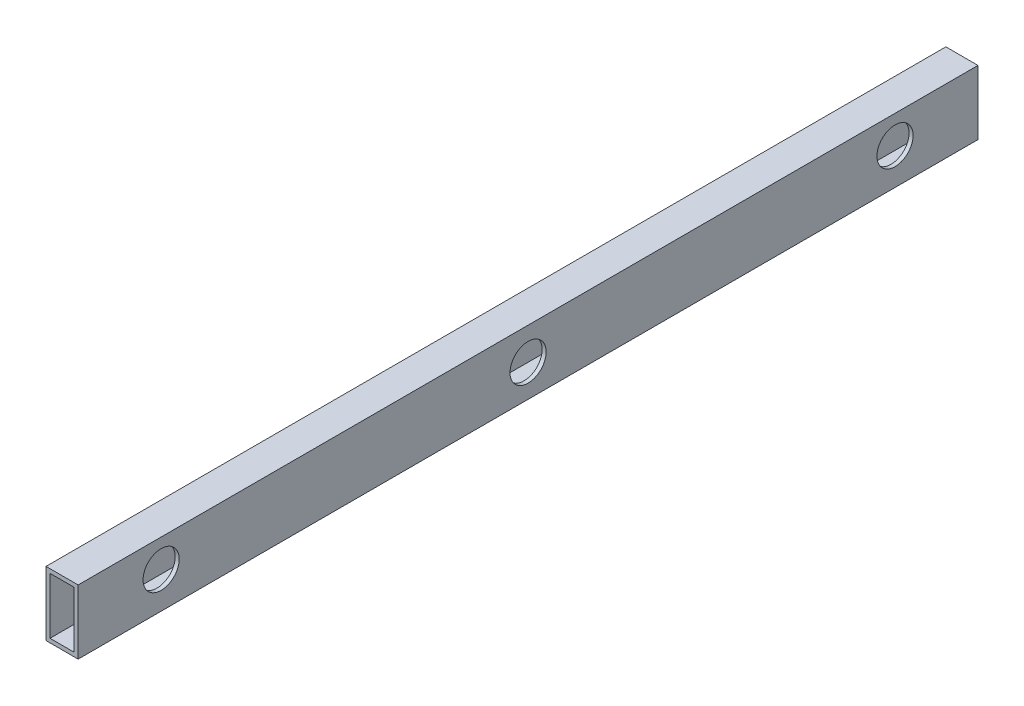
ISO-10303-21;
HEADER;
FILE_DESCRIPTION(('STEP AP214'),'2;1');
FILE_NAME('part.step','',(''),(''),'','','');
FILE_SCHEMA(('AUTOMOTIVE_DESIGN { 1 0 10303 214 1 1 1 1 }'));
ENDSEC;
DATA;
#1=APPLICATION_CONTEXT('core data for automotive mechanical design processes');
#2=APPLICATION_PROTOCOL_DEFINITION('international standard','automotive_design',2000,#1);
#3=PRODUCT_CONTEXT('',#1,'mechanical');
#4=PRODUCT('Part','Part','',(#3));
#5=PRODUCT_RELATED_PRODUCT_CATEGORY('part','',(#4));
#6=PRODUCT_DEFINITION_FORMATION('','',#4);
#7=PRODUCT_DEFINITION_CONTEXT('part definition',#1,'design');
#8=PRODUCT_DEFINITION('design','',#6,#7);
#9=PRODUCT_DEFINITION_SHAPE('','',#8);
#10=(LENGTH_UNIT() NAMED_UNIT(*) SI_UNIT(.MILLI.,.METRE.));
#11=(NAMED_UNIT(*) PLANE_ANGLE_UNIT() SI_UNIT($,.RADIAN.));
#12=(NAMED_UNIT(*) SI_UNIT($,.STERADIAN.) SOLID_ANGLE_UNIT());
#13=UNCERTAINTY_MEASURE_WITH_UNIT(LENGTH_MEASURE(1.E-05),#10,'distance_accuracy_value','');
#14=(GEOMETRIC_REPRESENTATION_CONTEXT(3) GLOBAL_UNCERTAINTY_ASSIGNED_CONTEXT((#13)) GLOBAL_UNIT_ASSIGNED_CONTEXT((#10,
#11,#12)) REPRESENTATION_CONTEXT('',''));
#15=CARTESIAN_POINT('',(0.,0.,0.));
#16=DIRECTION('',(0.,0.,1.));
#17=DIRECTION('',(1.,0.,0.));
#18=AXIS2_PLACEMENT_3D('',#15,#16,#17);
#19=CARTESIAN_POINT('',(0.,0.,355.6));
#20=DIRECTION('',(0.,0.,1.));
#21=DIRECTION('',(1.,0.,0.));
#22=AXIS2_PLACEMENT_3D('',#19,#20,#21);
#23=PLANE('',#22);
#24=DIRECTION('',(0.,1.,0.));
#25=VECTOR('',#24,1.);
#26=CARTESIAN_POINT('',(292.1,-25.4,355.6));
#27=LINE('',#26,#25);
#28=CARTESIAN_POINT('',(292.1,-25.4,355.6));
#29=VERTEX_POINT('',#28);
#30=CARTESIAN_POINT('',(292.1,25.4,355.6));
#31=VERTEX_POINT('',#30);
#32=EDGE_CURVE('E124',#29,#31,#27,.T.);
#33=ORIENTED_EDGE('',*,*,#32,.T.);
#34=DIRECTION('',(-1.,0.,0.));
#35=VECTOR('',#34,1.);
#36=CARTESIAN_POINT('',(292.1,25.4,355.6));
#37=LINE('',#36,#35);
#38=CARTESIAN_POINT('',(266.7,25.4,355.6));
#39=VERTEX_POINT('',#38);
#40=EDGE_CURVE('E172',#31,#39,#37,.T.);
#41=ORIENTED_EDGE('',*,*,#40,.T.);
#42=DIRECTION('',(0.,-1.,0.));
#43=VECTOR('',#42,1.);
#44=CARTESIAN_POINT('',(266.7,-25.4,355.6));
#45=LINE('',#44,#43);
#46=CARTESIAN_POINT('',(266.7,-25.4,355.6));
#47=VERTEX_POINT('',#46);
#48=EDGE_CURVE('E174',#39,#47,#45,.T.);
#49=ORIENTED_EDGE('',*,*,#48,.T.);
#50=DIRECTION('',(1.,0.,0.));
#51=VECTOR('',#50,1.);
#52=CARTESIAN_POINT('',(292.1,-25.4,355.6));
#53=LINE('',#52,#51);
#54=EDGE_CURVE('E71',#47,#29,#53,.T.);
#55=ORIENTED_EDGE('',*,*,#54,.T.);
#56=EDGE_LOOP('',(#33,#41,#49,#55));
#57=FACE_BOUND('',#56,.T.);
#58=DIRECTION('',(-1.,0.,0.));
#59=VECTOR('',#58,1.);
#60=CARTESIAN_POINT('',(288.925,22.225,355.6));
#61=LINE('',#60,#59);
#62=CARTESIAN_POINT('',(288.925,22.225,355.6));
#63=VERTEX_POINT('',#62);
#64=CARTESIAN_POINT('',(269.875,22.225,355.6));
#65=VERTEX_POINT('',#64);
#66=EDGE_CURVE('E161',#63,#65,#61,.T.);
#67=ORIENTED_EDGE('',*,*,#66,.F.);
#68=DIRECTION('',(0.,1.,0.));
#69=VECTOR('',#68,1.);
#70=CARTESIAN_POINT('',(288.925,-22.225,355.6));
#71=LINE('',#70,#69);
#72=CARTESIAN_POINT('',(288.925,-22.225,355.6));
#73=VERTEX_POINT('',#72);
#74=EDGE_CURVE('E121',#73,#63,#71,.T.);
#75=ORIENTED_EDGE('',*,*,#74,.F.);
#76=DIRECTION('',(1.,0.,0.));
#77=VECTOR('',#76,1.);
#78=CARTESIAN_POINT('',(288.925,-22.225,355.6));
#79=LINE('',#78,#77);
#80=CARTESIAN_POINT('',(269.875,-22.225,355.6));
#81=VERTEX_POINT('',#80);
#82=EDGE_CURVE('E165',#81,#73,#79,.T.);
#83=ORIENTED_EDGE('',*,*,#82,.F.);
#84=DIRECTION('',(0.,-1.,0.));
#85=VECTOR('',#84,1.);
#86=CARTESIAN_POINT('',(269.875,-22.225,355.6));
#87=LINE('',#86,#85);
#88=EDGE_CURVE('E163',#65,#81,#87,.T.);
#89=ORIENTED_EDGE('',*,*,#88,.F.);
#90=EDGE_LOOP('',(#67,#75,#83,#89));
#91=FACE_BOUND('',#90,.T.);
#92=ADVANCED_FACE('F46',(#57,#91),#23,.T.);
#93=CARTESIAN_POINT('',(292.1,-25.4,355.6));
#94=DIRECTION('',(-1.,0.,0.));
#95=DIRECTION('',(0.,0.,1.));
#96=AXIS2_PLACEMENT_3D('',#93,#94,#95);
#97=PLANE('',#96);
#98=CARTESIAN_POINT('',(292.1,3.17500000000004,-290.007440578742));
#99=DIRECTION('',(1.,0.,0.));
#100=DIRECTION('',(0.,0.,-1.));
#101=AXIS2_PLACEMENT_3D('',#98,#99,#100);
#102=CIRCLE('',#101,14.2875);
#103=CARTESIAN_POINT('',(292.1,3.17500000000004,-304.294940578742));
#104=VERTEX_POINT('',#103);
#105=EDGE_CURVE('E185',#104,#104,#102,.T.);
#106=ORIENTED_EDGE('',*,*,#105,.F.);
#107=EDGE_LOOP('',(#106));
#108=FACE_BOUND('',#107,.T.);
#109=CARTESIAN_POINT('',(292.1,0.,0.));
#110=DIRECTION('',(1.,0.,0.));
#111=DIRECTION('',(0.,0.,-1.));
#112=AXIS2_PLACEMENT_3D('',#109,#110,#111);
#113=CIRCLE('',#112,14.2875);
#114=CARTESIAN_POINT('',(292.1,0.,-14.2875));
#115=VERTEX_POINT('',#114);
#116=EDGE_CURVE('E287',#115,#115,#113,.T.);
#117=ORIENTED_EDGE('',*,*,#116,.F.);
#118=EDGE_LOOP('',(#117));
#119=FACE_BOUND('',#118,.T.);
#120=CARTESIAN_POINT('',(292.1,3.17499999999996,290.007440578742));
#121=DIRECTION('',(1.,0.,0.));
#122=DIRECTION('',(0.,0.,-1.));
#123=AXIS2_PLACEMENT_3D('',#120,#121,#122);
#124=CIRCLE('',#123,14.2875);
#125=CARTESIAN_POINT('',(292.1,3.17499999999996,275.719940578742));
#126=VERTEX_POINT('',#125);
#127=EDGE_CURVE('E289',#126,#126,#124,.T.);
#128=ORIENTED_EDGE('',*,*,#127,.F.);
#129=EDGE_LOOP('',(#128));
#130=FACE_BOUND('',#129,.T.);
#131=DIRECTION('',(0.,0.,-1.));
#132=VECTOR('',#131,1.);
#133=CARTESIAN_POINT('',(292.1,-25.4,355.6));
#134=LINE('',#133,#132);
#135=CARTESIAN_POINT('',(292.1,-25.4,-355.6));
#136=VERTEX_POINT('',#135);
#137=EDGE_CURVE('E177',#29,#136,#134,.T.);
#138=ORIENTED_EDGE('',*,*,#137,.T.);
#139=DIRECTION('',(0.,1.,0.));
#140=VECTOR('',#139,1.);
#141=CARTESIAN_POINT('',(292.1,-25.4,-355.6));
#142=LINE('',#141,#140);
#143=CARTESIAN_POINT('',(292.1,25.4,-355.6));
#144=VERTEX_POINT('',#143);
#145=EDGE_CURVE('E148',#136,#144,#142,.T.);
#146=ORIENTED_EDGE('',*,*,#145,.T.);
#147=DIRECTION('',(0.,0.,-1.));
#148=VECTOR('',#147,1.);
#149=CARTESIAN_POINT('',(292.1,25.4,355.6));
#150=LINE('',#149,#148);
#151=EDGE_CURVE('E13',#31,#144,#150,.T.);
#152=ORIENTED_EDGE('',*,*,#151,.F.);
#153=ORIENTED_EDGE('',*,*,#32,.F.);
#154=EDGE_LOOP('',(#138,#146,#152,#153));
#155=FACE_BOUND('',#154,.T.);
#156=ADVANCED_FACE('F48',(#108,#119,#130,#155),#97,.F.);
#157=CARTESIAN_POINT('',(292.1,25.4,355.6));
#158=DIRECTION('',(0.,-1.,0.));
#159=DIRECTION('',(0.,0.,-1.));
#160=AXIS2_PLACEMENT_3D('',#157,#158,#159);
#161=PLANE('',#160);
#162=ORIENTED_EDGE('',*,*,#151,.T.);
#163=DIRECTION('',(-1.,0.,0.));
#164=VECTOR('',#163,1.);
#165=CARTESIAN_POINT('',(292.1,25.4,-355.6));
#166=LINE('',#165,#164);
#167=CARTESIAN_POINT('',(266.7,25.4,-355.6));
#168=VERTEX_POINT('',#167);
#169=EDGE_CURVE('E151',#144,#168,#166,.T.);
#170=ORIENTED_EDGE('',*,*,#169,.T.);
#171=DIRECTION('',(0.,0.,-1.));
#172=VECTOR('',#171,1.);
#173=CARTESIAN_POINT('',(266.7,25.4,355.6));
#174=LINE('',#173,#172);
#175=EDGE_CURVE('E55',#39,#168,#174,.T.);
#176=ORIENTED_EDGE('',*,*,#175,.F.);
#177=ORIENTED_EDGE('',*,*,#40,.F.);
#178=EDGE_LOOP('',(#162,#170,#176,#177));
#179=FACE_BOUND('',#178,.T.);
#180=ADVANCED_FACE('F225',(#179),#161,.F.);
#181=CARTESIAN_POINT('',(266.7,-25.4,355.6));
#182=DIRECTION('',(1.,0.,0.));
#183=DIRECTION('',(0.,0.,-1.));
#184=AXIS2_PLACEMENT_3D('',#181,#182,#183);
#185=PLANE('',#184);
#186=CARTESIAN_POINT('',(266.7,3.17500000000004,-290.007440578742));
#187=DIRECTION('',(1.,0.,0.));
#188=DIRECTION('',(0.,0.,-1.));
#189=AXIS2_PLACEMENT_3D('',#186,#187,#188);
#190=CIRCLE('',#189,14.2875);
#191=CARTESIAN_POINT('',(266.7,3.17500000000004,-304.294940578742));
#192=VERTEX_POINT('',#191);
#193=EDGE_CURVE('E139',#192,#192,#190,.F.);
#194=ORIENTED_EDGE('',*,*,#193,.F.);
#195=EDGE_LOOP('',(#194));
#196=FACE_BOUND('',#195,.T.);
#197=CARTESIAN_POINT('',(266.7,0.,0.));
#198=DIRECTION('',(1.,0.,0.));
#199=DIRECTION('',(0.,0.,-1.));
#200=AXIS2_PLACEMENT_3D('',#197,#198,#199);
#201=CIRCLE('',#200,14.2875);
#202=CARTESIAN_POINT('',(266.7,0.,-14.2875));
#203=VERTEX_POINT('',#202);
#204=EDGE_CURVE('E193',#203,#203,#201,.F.);
#205=ORIENTED_EDGE('',*,*,#204,.F.);
#206=EDGE_LOOP('',(#205));
#207=FACE_BOUND('',#206,.T.);
#208=CARTESIAN_POINT('',(266.7,3.17499999999996,290.007440578742));
#209=DIRECTION('',(1.,0.,0.));
#210=DIRECTION('',(0.,0.,-1.));
#211=AXIS2_PLACEMENT_3D('',#208,#209,#210);
#212=CIRCLE('',#211,14.2875);
#213=CARTESIAN_POINT('',(266.7,3.17499999999996,275.719940578742));
#214=VERTEX_POINT('',#213);
#215=EDGE_CURVE('E189',#214,#214,#212,.F.);
#216=ORIENTED_EDGE('',*,*,#215,.F.);
#217=EDGE_LOOP('',(#216));
#218=FACE_BOUND('',#217,.T.);
#219=ORIENTED_EDGE('',*,*,#175,.T.);
#220=DIRECTION('',(0.,-1.,0.));
#221=VECTOR('',#220,1.);
#222=CARTESIAN_POINT('',(266.7,-25.4,-355.6));
#223=LINE('',#222,#221);
#224=CARTESIAN_POINT('',(266.7,-25.4,-355.6));
#225=VERTEX_POINT('',#224);
#226=EDGE_CURVE('E154',#168,#225,#223,.T.);
#227=ORIENTED_EDGE('',*,*,#226,.T.);
#228=DIRECTION('',(0.,0.,-1.));
#229=VECTOR('',#228,1.);
#230=CARTESIAN_POINT('',(266.7,-25.4,355.6));
#231=LINE('',#230,#229);
#232=EDGE_CURVE('E179',#47,#225,#231,.T.);
#233=ORIENTED_EDGE('',*,*,#232,.F.);
#234=ORIENTED_EDGE('',*,*,#48,.F.);
#235=EDGE_LOOP('',(#219,#227,#233,#234));
#236=FACE_BOUND('',#235,.T.);
#237=ADVANCED_FACE('F221',(#196,#207,#218,#236),#185,.F.);
#238=CARTESIAN_POINT('',(292.1,-25.4,355.6));
#239=DIRECTION('',(0.,1.,0.));
#240=DIRECTION('',(0.,0.,1.));
#241=AXIS2_PLACEMENT_3D('',#238,#239,#240);
#242=PLANE('',#241);
#243=ORIENTED_EDGE('',*,*,#232,.T.);
#244=DIRECTION('',(1.,0.,0.));
#245=VECTOR('',#244,1.);
#246=CARTESIAN_POINT('',(292.1,-25.4,-355.6));
#247=LINE('',#246,#245);
#248=EDGE_CURVE('E157',#225,#136,#247,.T.);
#249=ORIENTED_EDGE('',*,*,#248,.T.);
#250=ORIENTED_EDGE('',*,*,#137,.F.);
#251=ORIENTED_EDGE('',*,*,#54,.F.);
#252=EDGE_LOOP('',(#243,#249,#250,#251));
#253=FACE_BOUND('',#252,.T.);
#254=ADVANCED_FACE('F224',(#253),#242,.F.);
#255=CARTESIAN_POINT('',(288.925,-22.225,355.6));
#256=DIRECTION('',(-1.,0.,0.));
#257=DIRECTION('',(0.,0.,1.));
#258=AXIS2_PLACEMENT_3D('',#255,#256,#257);
#259=PLANE('',#258);
#260=CARTESIAN_POINT('',(288.925,3.17500000000004,-290.007440578742));
#261=DIRECTION('',(-1.,0.,0.));
#262=DIRECTION('',(0.,0.,1.));
#263=AXIS2_PLACEMENT_3D('',#260,#261,#262);
#264=CIRCLE('',#263,14.2875);
#265=CARTESIAN_POINT('',(288.925,3.17500000000004,-275.719940578742));
#266=VERTEX_POINT('',#265);
#267=EDGE_CURVE('E142',#266,#266,#264,.F.);
#268=ORIENTED_EDGE('',*,*,#267,.T.);
#269=EDGE_LOOP('',(#268));
#270=FACE_BOUND('',#269,.T.);
#271=CARTESIAN_POINT('',(288.925,0.,0.));
#272=DIRECTION('',(-1.,0.,0.));
#273=DIRECTION('',(0.,0.,1.));
#274=AXIS2_PLACEMENT_3D('',#271,#272,#273);
#275=CIRCLE('',#274,14.2875);
#276=CARTESIAN_POINT('',(288.925,0.,14.2875));
#277=VERTEX_POINT('',#276);
#278=EDGE_CURVE('E188',#277,#277,#275,.F.);
#279=ORIENTED_EDGE('',*,*,#278,.T.);
#280=EDGE_LOOP('',(#279));
#281=FACE_BOUND('',#280,.T.);
#282=CARTESIAN_POINT('',(288.925,3.17499999999996,290.007440578742));
#283=DIRECTION('',(-1.,0.,0.));
#284=DIRECTION('',(0.,0.,1.));
#285=AXIS2_PLACEMENT_3D('',#282,#283,#284);
#286=CIRCLE('',#285,14.2875);
#287=CARTESIAN_POINT('',(288.925,3.17499999999996,304.294940578742));
#288=VERTEX_POINT('',#287);
#289=EDGE_CURVE('E184',#288,#288,#286,.F.);
#290=ORIENTED_EDGE('',*,*,#289,.T.);
#291=EDGE_LOOP('',(#290));
#292=FACE_BOUND('',#291,.T.);
#293=DIRECTION('',(0.,0.,-1.));
#294=VECTOR('',#293,1.);
#295=CARTESIAN_POINT('',(288.925,22.225,355.6));
#296=LINE('',#295,#294);
#297=CARTESIAN_POINT('',(288.925,22.225,-355.6));
#298=VERTEX_POINT('',#297);
#299=EDGE_CURVE('E113',#63,#298,#296,.T.);
#300=ORIENTED_EDGE('',*,*,#299,.T.);
#301=DIRECTION('',(0.,1.,0.));
#302=VECTOR('',#301,1.);
#303=CARTESIAN_POINT('',(288.925,-22.225,-355.6));
#304=LINE('',#303,#302);
#305=CARTESIAN_POINT('',(288.925,-22.225,-355.6));
#306=VERTEX_POINT('',#305);
#307=EDGE_CURVE('E118',#306,#298,#304,.T.);
#308=ORIENTED_EDGE('',*,*,#307,.F.);
#309=DIRECTION('',(0.,0.,-1.));
#310=VECTOR('',#309,1.);
#311=CARTESIAN_POINT('',(288.925,-22.225,355.6));
#312=LINE('',#311,#310);
#313=EDGE_CURVE('E167',#73,#306,#312,.T.);
#314=ORIENTED_EDGE('',*,*,#313,.F.);
#315=ORIENTED_EDGE('',*,*,#74,.T.);
#316=EDGE_LOOP('',(#300,#308,#314,#315));
#317=FACE_BOUND('',#316,.T.);
#318=ADVANCED_FACE('F115',(#270,#281,#292,#317),#259,.T.);
#319=CARTESIAN_POINT('',(288.925,22.225,355.6));
#320=DIRECTION('',(0.,-1.,0.));
#321=DIRECTION('',(0.,0.,-1.));
#322=AXIS2_PLACEMENT_3D('',#319,#320,#321);
#323=PLANE('',#322);
#324=DIRECTION('',(0.,0.,-1.));
#325=VECTOR('',#324,1.);
#326=CARTESIAN_POINT('',(269.875,22.225,355.6));
#327=LINE('',#326,#325);
#328=CARTESIAN_POINT('',(269.875,22.225,-355.6));
#329=VERTEX_POINT('',#328);
#330=EDGE_CURVE('E125',#65,#329,#327,.T.);
#331=ORIENTED_EDGE('',*,*,#330,.T.);
#332=DIRECTION('',(-1.,0.,0.));
#333=VECTOR('',#332,1.);
#334=CARTESIAN_POINT('',(288.925,22.225,-355.6));
#335=LINE('',#334,#333);
#336=EDGE_CURVE('E128',#298,#329,#335,.T.);
#337=ORIENTED_EDGE('',*,*,#336,.F.);
#338=ORIENTED_EDGE('',*,*,#299,.F.);
#339=ORIENTED_EDGE('',*,*,#66,.T.);
#340=EDGE_LOOP('',(#331,#337,#338,#339));
#341=FACE_BOUND('',#340,.T.);
#342=ADVANCED_FACE('F129',(#341),#323,.T.);
#343=CARTESIAN_POINT('',(269.875,-22.225,355.6));
#344=DIRECTION('',(1.,0.,0.));
#345=DIRECTION('',(0.,0.,-1.));
#346=AXIS2_PLACEMENT_3D('',#343,#344,#345);
#347=PLANE('',#346);
#348=CARTESIAN_POINT('',(269.875,3.17500000000004,-290.007440578742));
#349=DIRECTION('',(1.,0.,0.));
#350=DIRECTION('',(0.,0.,-1.));
#351=AXIS2_PLACEMENT_3D('',#348,#349,#350);
#352=CIRCLE('',#351,14.2875);
#353=CARTESIAN_POINT('',(269.875,3.17500000000004,-304.294940578742));
#354=VERTEX_POINT('',#353);
#355=EDGE_CURVE('E50',#354,#354,#352,.F.);
#356=ORIENTED_EDGE('',*,*,#355,.T.);
#357=EDGE_LOOP('',(#356));
#358=FACE_BOUND('',#357,.T.);
#359=CARTESIAN_POINT('',(269.875,0.,0.));
#360=DIRECTION('',(1.,0.,0.));
#361=DIRECTION('',(0.,0.,-1.));
#362=AXIS2_PLACEMENT_3D('',#359,#360,#361);
#363=CIRCLE('',#362,14.2875);
#364=CARTESIAN_POINT('',(269.875,0.,-14.2875));
#365=VERTEX_POINT('',#364);
#366=EDGE_CURVE('E186',#365,#365,#363,.F.);
#367=ORIENTED_EDGE('',*,*,#366,.T.);
#368=EDGE_LOOP('',(#367));
#369=FACE_BOUND('',#368,.T.);
#370=CARTESIAN_POINT('',(269.875,3.17499999999996,290.007440578742));
#371=DIRECTION('',(1.,0.,0.));
#372=DIRECTION('',(0.,0.,-1.));
#373=AXIS2_PLACEMENT_3D('',#370,#371,#372);
#374=CIRCLE('',#373,14.2875);
#375=CARTESIAN_POINT('',(269.875,3.17499999999996,275.719940578742));
#376=VERTEX_POINT('',#375);
#377=EDGE_CURVE('E182',#376,#376,#374,.F.);
#378=ORIENTED_EDGE('',*,*,#377,.T.);
#379=EDGE_LOOP('',(#378));
#380=FACE_BOUND('',#379,.T.);
#381=DIRECTION('',(0.,0.,-1.));
#382=VECTOR('',#381,1.);
#383=CARTESIAN_POINT('',(269.875,-22.225,355.6));
#384=LINE('',#383,#382);
#385=CARTESIAN_POINT('',(269.875,-22.225,-355.6));
#386=VERTEX_POINT('',#385);
#387=EDGE_CURVE('E63',#81,#386,#384,.T.);
#388=ORIENTED_EDGE('',*,*,#387,.T.);
#389=DIRECTION('',(0.,-1.,0.));
#390=VECTOR('',#389,1.);
#391=CARTESIAN_POINT('',(269.875,-22.225,-355.6));
#392=LINE('',#391,#390);
#393=EDGE_CURVE('E134',#329,#386,#392,.T.);
#394=ORIENTED_EDGE('',*,*,#393,.F.);
#395=ORIENTED_EDGE('',*,*,#330,.F.);
#396=ORIENTED_EDGE('',*,*,#88,.T.);
#397=EDGE_LOOP('',(#388,#394,#395,#396));
#398=FACE_BOUND('',#397,.T.);
#399=ADVANCED_FACE('F210',(#358,#369,#380,#398),#347,.T.);
#400=CARTESIAN_POINT('',(288.925,-22.225,355.6));
#401=DIRECTION('',(0.,1.,0.));
#402=DIRECTION('',(-1.,0.,0.));
#403=AXIS2_PLACEMENT_3D('',#400,#401,#402);
#404=PLANE('',#403);
#405=ORIENTED_EDGE('',*,*,#313,.T.);
#406=DIRECTION('',(1.,0.,0.));
#407=VECTOR('',#406,1.);
#408=CARTESIAN_POINT('',(288.925,-22.225,-355.6));
#409=LINE('',#408,#407);
#410=EDGE_CURVE('E138',#386,#306,#409,.T.);
#411=ORIENTED_EDGE('',*,*,#410,.F.);
#412=ORIENTED_EDGE('',*,*,#387,.F.);
#413=ORIENTED_EDGE('',*,*,#82,.T.);
#414=EDGE_LOOP('',(#405,#411,#412,#413));
#415=FACE_BOUND('',#414,.T.);
#416=ADVANCED_FACE('F260',(#415),#404,.T.);
#417=CARTESIAN_POINT('',(0.,0.,-355.6));
#418=DIRECTION('',(0.,0.,1.));
#419=DIRECTION('',(1.,0.,0.));
#420=AXIS2_PLACEMENT_3D('',#417,#418,#419);
#421=PLANE('',#420);
#422=ORIENTED_EDGE('',*,*,#410,.T.);
#423=ORIENTED_EDGE('',*,*,#307,.T.);
#424=ORIENTED_EDGE('',*,*,#336,.T.);
#425=ORIENTED_EDGE('',*,*,#393,.T.);
#426=EDGE_LOOP('',(#422,#423,#424,#425));
#427=FACE_BOUND('',#426,.T.);
#428=ORIENTED_EDGE('',*,*,#145,.F.);
#429=ORIENTED_EDGE('',*,*,#248,.F.);
#430=ORIENTED_EDGE('',*,*,#226,.F.);
#431=ORIENTED_EDGE('',*,*,#169,.F.);
#432=EDGE_LOOP('',(#428,#429,#430,#431));
#433=FACE_BOUND('',#432,.T.);
#434=ADVANCED_FACE('F136',(#427,#433),#421,.F.);
#435=CARTESIAN_POINT('',(292.1,3.17499999999996,290.007440578742));
#436=DIRECTION('',(-1.,0.,0.));
#437=DIRECTION('',(0.,0.,1.));
#438=AXIS2_PLACEMENT_3D('',#435,#436,#437);
#439=CYLINDRICAL_SURFACE('',#438,14.2875);
#440=ORIENTED_EDGE('',*,*,#377,.F.);
#441=EDGE_LOOP('',(#440));
#442=FACE_BOUND('',#441,.T.);
#443=ORIENTED_EDGE('',*,*,#215,.T.);
#444=EDGE_LOOP('',(#443));
#445=FACE_BOUND('',#444,.T.);
#446=ADVANCED_FACE('F265',(#442,#445),#439,.F.);
#447=CARTESIAN_POINT('',(292.1,0.,0.));
#448=DIRECTION('',(-1.,0.,0.));
#449=DIRECTION('',(0.,0.,1.));
#450=AXIS2_PLACEMENT_3D('',#447,#448,#449);
#451=CYLINDRICAL_SURFACE('',#450,14.2875);
#452=ORIENTED_EDGE('',*,*,#366,.F.);
#453=EDGE_LOOP('',(#452));
#454=FACE_BOUND('',#453,.T.);
#455=ORIENTED_EDGE('',*,*,#204,.T.);
#456=EDGE_LOOP('',(#455));
#457=FACE_BOUND('',#456,.T.);
#458=ADVANCED_FACE('F216',(#454,#457),#451,.F.);
#459=CARTESIAN_POINT('',(292.1,3.17500000000004,-290.007440578742));
#460=DIRECTION('',(-1.,0.,0.));
#461=DIRECTION('',(0.,0.,1.));
#462=AXIS2_PLACEMENT_3D('',#459,#460,#461);
#463=CYLINDRICAL_SURFACE('',#462,14.2875);
#464=ORIENTED_EDGE('',*,*,#355,.F.);
#465=EDGE_LOOP('',(#464));
#466=FACE_BOUND('',#465,.T.);
#467=ORIENTED_EDGE('',*,*,#193,.T.);
#468=EDGE_LOOP('',(#467));
#469=FACE_BOUND('',#468,.T.);
#470=ADVANCED_FACE('F212',(#466,#469),#463,.F.);
#471=ORIENTED_EDGE('',*,*,#289,.F.);
#472=EDGE_LOOP('',(#471));
#473=FACE_BOUND('',#472,.T.);
#474=ORIENTED_EDGE('',*,*,#127,.T.);
#475=EDGE_LOOP('',(#474));
#476=FACE_BOUND('',#475,.T.);
#477=ADVANCED_FACE('F215',(#473,#476),#439,.F.);
#478=ORIENTED_EDGE('',*,*,#278,.F.);
#479=EDGE_LOOP('',(#478));
#480=FACE_BOUND('',#479,.T.);
#481=ORIENTED_EDGE('',*,*,#116,.T.);
#482=EDGE_LOOP('',(#481));
#483=FACE_BOUND('',#482,.T.);
#484=ADVANCED_FACE('F271',(#480,#483),#451,.F.);
#485=ORIENTED_EDGE('',*,*,#267,.F.);
#486=EDGE_LOOP('',(#485));
#487=FACE_BOUND('',#486,.T.);
#488=ORIENTED_EDGE('',*,*,#105,.T.);
#489=EDGE_LOOP('',(#488));
#490=FACE_BOUND('',#489,.T.);
#491=ADVANCED_FACE('F218',(#487,#490),#463,.F.);
#492=CLOSED_SHELL('',(#92,#156,#180,#237,#254,#318,#342,#399,#416,#434,#446,#458,#470,#477,#484,#491));
#493=MANIFOLD_SOLID_BREP('B2',#492);
#494=ADVANCED_BREP_SHAPE_REPRESENTATION('',(#18,#493),#14);
#495=SHAPE_DEFINITION_REPRESENTATION(#9,#494);
ENDSEC;
END-ISO-10303-21;
